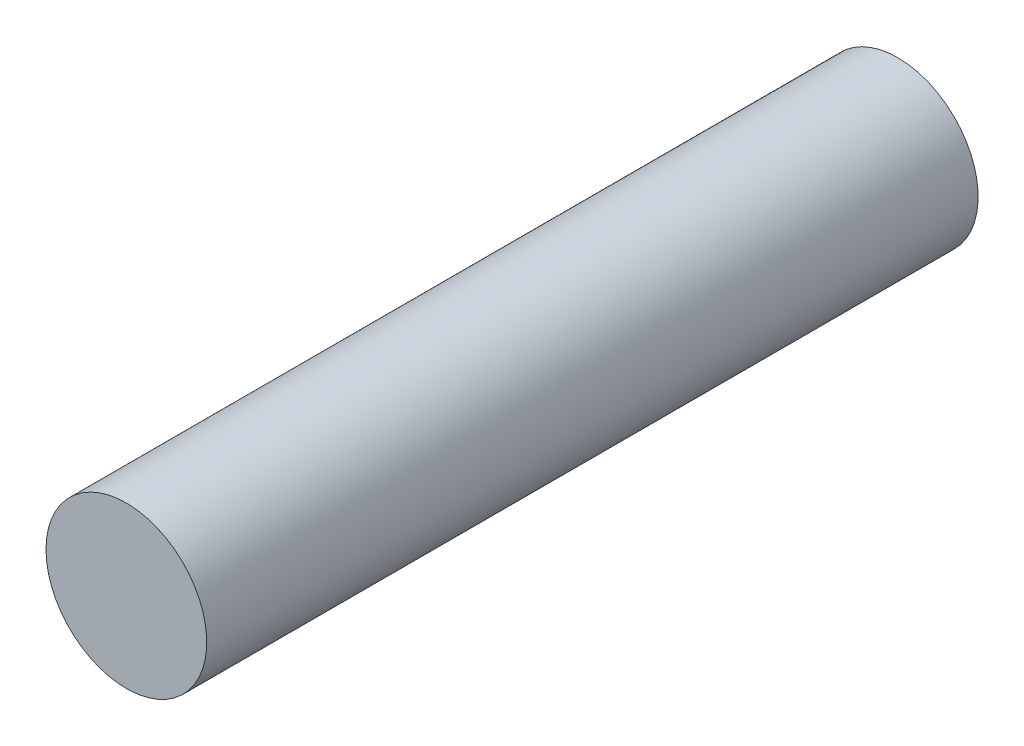
ISO-10303-21;
HEADER;
FILE_DESCRIPTION(('STEP AP214'),'2;1');
FILE_NAME('part.step','',(''),(''),'','','');
FILE_SCHEMA(('AUTOMOTIVE_DESIGN { 1 0 10303 214 1 1 1 1 }'));
ENDSEC;
DATA;
#1=APPLICATION_CONTEXT('core data for automotive mechanical design processes');
#2=APPLICATION_PROTOCOL_DEFINITION('international standard','automotive_design',2000,#1);
#3=PRODUCT_CONTEXT('',#1,'mechanical');
#4=PRODUCT('Part','Part','',(#3));
#5=PRODUCT_RELATED_PRODUCT_CATEGORY('part','',(#4));
#6=PRODUCT_DEFINITION_FORMATION('','',#4);
#7=PRODUCT_DEFINITION_CONTEXT('part definition',#1,'design');
#8=PRODUCT_DEFINITION('design','',#6,#7);
#9=PRODUCT_DEFINITION_SHAPE('','',#8);
#10=(LENGTH_UNIT() NAMED_UNIT(*) SI_UNIT(.MILLI.,.METRE.));
#11=(NAMED_UNIT(*) PLANE_ANGLE_UNIT() SI_UNIT($,.RADIAN.));
#12=(NAMED_UNIT(*) SI_UNIT($,.STERADIAN.) SOLID_ANGLE_UNIT());
#13=UNCERTAINTY_MEASURE_WITH_UNIT(LENGTH_MEASURE(1.E-05),#10,'distance_accuracy_value','');
#14=(GEOMETRIC_REPRESENTATION_CONTEXT(3) GLOBAL_UNCERTAINTY_ASSIGNED_CONTEXT((#13)) GLOBAL_UNIT_ASSIGNED_CONTEXT((#10,
#11,#12)) REPRESENTATION_CONTEXT('',''));
#15=CARTESIAN_POINT('',(0.,0.,0.));
#16=DIRECTION('',(0.,0.,1.));
#17=DIRECTION('',(1.,0.,0.));
#18=AXIS2_PLACEMENT_3D('',#15,#16,#17);
#19=CARTESIAN_POINT('',(0.,0.,76.2));
#20=DIRECTION('',(0.,0.,-1.));
#21=DIRECTION('',(-1.,0.,0.));
#22=AXIS2_PLACEMENT_3D('',#19,#20,#21);
#23=CYLINDRICAL_SURFACE('',#22,7.9375);
#24=CARTESIAN_POINT('',(0.,0.,76.2));
#25=DIRECTION('',(0.,0.,1.));
#26=DIRECTION('',(1.,0.,0.));
#27=AXIS2_PLACEMENT_3D('',#24,#25,#26);
#28=CIRCLE('',#27,7.9375);
#29=CARTESIAN_POINT('',(-7.9375,0.,76.2));
#30=VERTEX_POINT('',#29);
#31=EDGE_CURVE('E10',#30,#30,#28,.T.);
#32=CARTESIAN_POINT('',(0.,0.,0.));
#33=DIRECTION('',(0.,0.,1.));
#34=DIRECTION('',(1.,0.,0.));
#35=AXIS2_PLACEMENT_3D('',#32,#33,#34);
#36=CIRCLE('',#35,7.9375);
#37=CARTESIAN_POINT('',(-7.9375,0.,0.));
#38=VERTEX_POINT('',#37);
#39=EDGE_CURVE('E34',#38,#38,#36,.T.);
#40=CARTESIAN_POINT('',(-7.9375,0.,76.2));
#41=CARTESIAN_POINT('',(-7.9375,0.,75.40625));
#42=CARTESIAN_POINT('',(-7.9375,0.,74.6125));
#43=CARTESIAN_POINT('',(-7.9375,0.,73.025));
#44=CARTESIAN_POINT('',(-7.9375,0.,72.23125));
#45=CARTESIAN_POINT('',(-7.9375,0.,70.64375));
#46=CARTESIAN_POINT('',(-7.9375,0.,69.85));
#47=CARTESIAN_POINT('',(-7.9375,0.,68.2625));
#48=CARTESIAN_POINT('',(-7.9375,0.,67.46875));
#49=CARTESIAN_POINT('',(-7.9375,0.,65.88125));
#50=CARTESIAN_POINT('',(-7.9375,0.,65.0875));
#51=CARTESIAN_POINT('',(-7.9375,0.,63.5));
#52=CARTESIAN_POINT('',(-7.9375,0.,62.70625));
#53=CARTESIAN_POINT('',(-7.9375,0.,61.11875));
#54=CARTESIAN_POINT('',(-7.9375,0.,60.325));
#55=CARTESIAN_POINT('',(-7.9375,0.,58.7375));
#56=CARTESIAN_POINT('',(-7.9375,0.,57.94375));
#57=CARTESIAN_POINT('',(-7.9375,0.,56.35625));
#58=CARTESIAN_POINT('',(-7.9375,0.,55.5625));
#59=CARTESIAN_POINT('',(-7.9375,0.,53.975));
#60=CARTESIAN_POINT('',(-7.9375,0.,53.18125));
#61=CARTESIAN_POINT('',(-7.9375,0.,51.59375));
#62=CARTESIAN_POINT('',(-7.9375,0.,50.8));
#63=CARTESIAN_POINT('',(-7.9375,0.,49.2125));
#64=CARTESIAN_POINT('',(-7.9375,0.,48.41875));
#65=CARTESIAN_POINT('',(-7.9375,0.,46.83125));
#66=CARTESIAN_POINT('',(-7.9375,0.,46.0375));
#67=CARTESIAN_POINT('',(-7.9375,0.,44.45));
#68=CARTESIAN_POINT('',(-7.9375,0.,43.65625));
#69=CARTESIAN_POINT('',(-7.9375,0.,42.06875));
#70=CARTESIAN_POINT('',(-7.9375,0.,41.275));
#71=CARTESIAN_POINT('',(-7.9375,0.,39.6875));
#72=CARTESIAN_POINT('',(-7.9375,0.,38.89375));
#73=CARTESIAN_POINT('',(-7.9375,0.,37.30625));
#74=CARTESIAN_POINT('',(-7.9375,0.,36.5125));
#75=CARTESIAN_POINT('',(-7.9375,0.,34.925));
#76=CARTESIAN_POINT('',(-7.9375,0.,34.13125));
#77=CARTESIAN_POINT('',(-7.9375,0.,32.54375));
#78=CARTESIAN_POINT('',(-7.9375,0.,31.75));
#79=CARTESIAN_POINT('',(-7.9375,0.,30.1625));
#80=CARTESIAN_POINT('',(-7.9375,0.,29.36875));
#81=CARTESIAN_POINT('',(-7.9375,0.,27.78125));
#82=CARTESIAN_POINT('',(-7.9375,0.,26.9875));
#83=CARTESIAN_POINT('',(-7.9375,0.,25.4));
#84=CARTESIAN_POINT('',(-7.9375,0.,24.60625));
#85=CARTESIAN_POINT('',(-7.9375,0.,23.01875));
#86=CARTESIAN_POINT('',(-7.9375,0.,22.225));
#87=CARTESIAN_POINT('',(-7.9375,0.,20.6375));
#88=CARTESIAN_POINT('',(-7.9375,0.,19.84375));
#89=CARTESIAN_POINT('',(-7.9375,0.,18.25625));
#90=CARTESIAN_POINT('',(-7.9375,0.,17.4625));
#91=CARTESIAN_POINT('',(-7.9375,0.,15.875));
#92=CARTESIAN_POINT('',(-7.9375,0.,15.08125));
#93=CARTESIAN_POINT('',(-7.9375,0.,13.49375));
#94=CARTESIAN_POINT('',(-7.9375,0.,12.7));
#95=CARTESIAN_POINT('',(-7.9375,0.,11.1125));
#96=CARTESIAN_POINT('',(-7.9375,0.,10.31875));
#97=CARTESIAN_POINT('',(-7.9375,0.,8.73125));
#98=CARTESIAN_POINT('',(-7.9375,0.,7.93750000000001));
#99=CARTESIAN_POINT('',(-7.9375,0.,6.35));
#100=CARTESIAN_POINT('',(-7.9375,0.,5.55625));
#101=CARTESIAN_POINT('',(-7.9375,0.,3.96875));
#102=CARTESIAN_POINT('',(-7.9375,0.,3.175));
#103=CARTESIAN_POINT('',(-7.9375,0.,1.5875));
#104=CARTESIAN_POINT('',(-7.9375,0.,0.793750000000001));
#105=CARTESIAN_POINT('',(-7.9375,0.,0.));
#106=B_SPLINE_CURVE_WITH_KNOTS('',3,(#40,#41,#42,#43,#44,#45,#46,#47,#48,#49,#50,#51,#52,#53,
#54,#55,#56,#57,#58,#59,#60,#61,#62,#63,#64,#65,#66,#67,#68,#69,#70,#71,#72,#73,#74,#75,#76,#77,
#78,#79,#80,#81,#82,#83,#84,#85,#86,#87,#88,#89,#90,#91,#92,#93,#94,#95,#96,#97,#98,#99,#100,
#101,#102,#103,#104,#105),.UNSPECIFIED.,.F.,.F.,(4,2,2,2,2,2,2,2,2,2,2,2,2,2,2,2,2,2,2,2,2,2,2,
2,2,2,2,2,2,2,2,2,4),(0.,2.38124999999999,4.76249999999999,7.14374999999999,9.52499999999999,
11.90625,14.2875,16.66875,19.05,21.43125,23.8125,26.19375,28.575,30.95625,33.3375,35.71875,38.1,
40.48125,42.8625,45.24375,47.625,50.00625,52.3875,54.76875,57.15,59.53125,61.9125,64.29375,
66.675,69.05625,71.4375,73.81875,76.2),.UNSPECIFIED.);
#107=EDGE_CURVE('BSEAM31',#30,#38,#106,.T.);
#108=ORIENTED_EDGE('',*,*,#31,.F.);
#109=ORIENTED_EDGE('',*,*,#39,.T.);
#110=ORIENTED_EDGE('',*,*,#107,.T.);
#111=ORIENTED_EDGE('',*,*,#107,.F.);
#112=EDGE_LOOP('',(#108,#110,#109,#111));
#113=FACE_BOUND('',#112,.T.);
#114=ADVANCED_FACE('F31',(#113),#23,.T.);
#115=CARTESIAN_POINT('',(0.,0.,76.2));
#116=DIRECTION('',(0.,0.,1.));
#117=DIRECTION('',(1.,0.,0.));
#118=AXIS2_PLACEMENT_3D('',#115,#116,#117);
#119=PLANE('',#118);
#120=ORIENTED_EDGE('',*,*,#31,.T.);
#121=EDGE_LOOP('',(#120));
#122=FACE_BOUND('',#121,.T.);
#123=ADVANCED_FACE('F46',(#122),#119,.T.);
#124=CARTESIAN_POINT('',(0.,0.,0.));
#125=DIRECTION('',(0.,0.,1.));
#126=DIRECTION('',(1.,0.,0.));
#127=AXIS2_PLACEMENT_3D('',#124,#125,#126);
#128=PLANE('',#127);
#129=ORIENTED_EDGE('',*,*,#39,.F.);
#130=EDGE_LOOP('',(#129));
#131=FACE_BOUND('',#130,.T.);
#132=ADVANCED_FACE('F44',(#131),#128,.F.);
#133=CLOSED_SHELL('',(#114,#123,#132));
#134=MANIFOLD_SOLID_BREP('B2',#133);
#135=ADVANCED_BREP_SHAPE_REPRESENTATION('',(#18,#134),#14);
#136=SHAPE_DEFINITION_REPRESENTATION(#9,#135);
ENDSEC;
END-ISO-10303-21;
